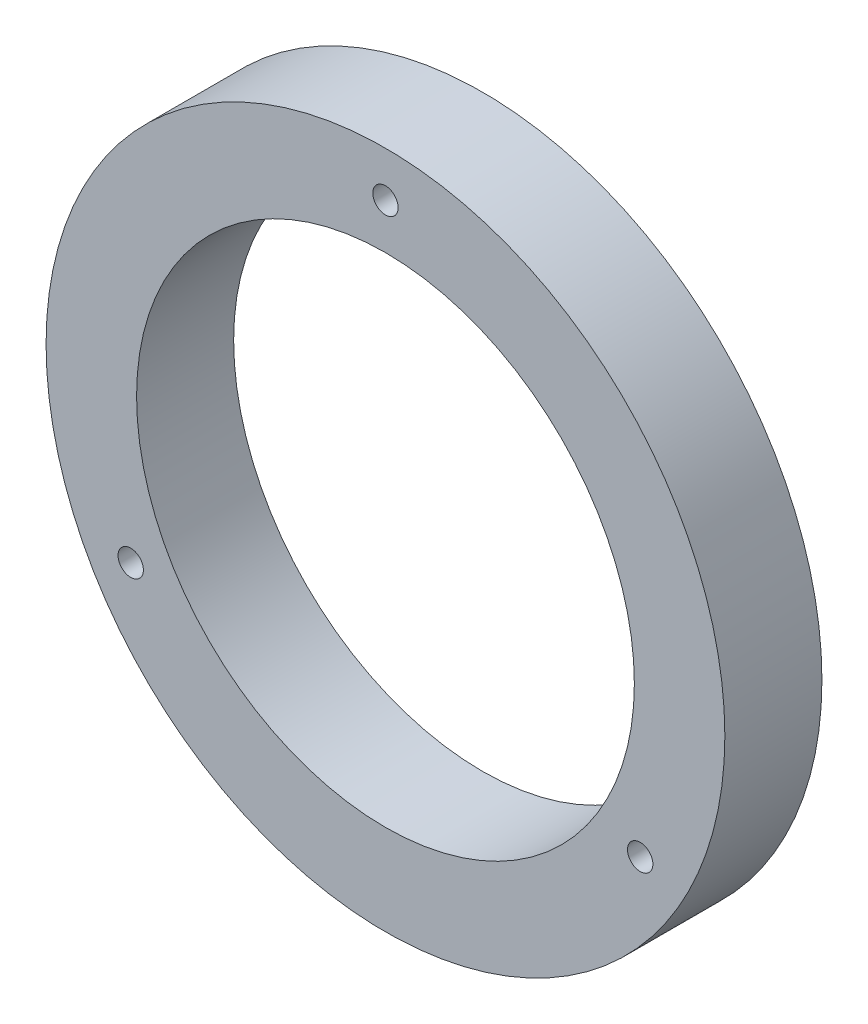
ISO-10303-21;
HEADER;
FILE_DESCRIPTION(('STEP AP214'),'2;1');
FILE_NAME('part.step','',(''),(''),'','','');
FILE_SCHEMA(('AUTOMOTIVE_DESIGN { 1 0 10303 214 1 1 1 1 }'));
ENDSEC;
DATA;
#1=APPLICATION_CONTEXT('core data for automotive mechanical design processes');
#2=APPLICATION_PROTOCOL_DEFINITION('international standard','automotive_design',2000,#1);
#3=PRODUCT_CONTEXT('',#1,'mechanical');
#4=PRODUCT('Part','Part','',(#3));
#5=PRODUCT_RELATED_PRODUCT_CATEGORY('part','',(#4));
#6=PRODUCT_DEFINITION_FORMATION('','',#4);
#7=PRODUCT_DEFINITION_CONTEXT('part definition',#1,'design');
#8=PRODUCT_DEFINITION('design','',#6,#7);
#9=PRODUCT_DEFINITION_SHAPE('','',#8);
#10=(LENGTH_UNIT() NAMED_UNIT(*) SI_UNIT(.MILLI.,.METRE.));
#11=(NAMED_UNIT(*) PLANE_ANGLE_UNIT() SI_UNIT($,.RADIAN.));
#12=(NAMED_UNIT(*) SI_UNIT($,.STERADIAN.) SOLID_ANGLE_UNIT());
#13=UNCERTAINTY_MEASURE_WITH_UNIT(LENGTH_MEASURE(1.E-05),#10,'distance_accuracy_value','');
#14=(GEOMETRIC_REPRESENTATION_CONTEXT(3) GLOBAL_UNCERTAINTY_ASSIGNED_CONTEXT((#13)) GLOBAL_UNIT_ASSIGNED_CONTEXT((#10,
#11,#12)) REPRESENTATION_CONTEXT('',''));
#15=CARTESIAN_POINT('',(0.,0.,0.));
#16=DIRECTION('',(0.,0.,1.));
#17=DIRECTION('',(1.,0.,0.));
#18=AXIS2_PLACEMENT_3D('',#15,#16,#17);
#19=CARTESIAN_POINT('',(0.,0.,21.45));
#20=DIRECTION('',(0.,0.,1.));
#21=DIRECTION('',(1.,0.,0.));
#22=AXIS2_PLACEMENT_3D('',#19,#20,#21);
#23=PLANE('',#22);
#24=CARTESIAN_POINT('',(0.,65.,21.45));
#25=DIRECTION('',(0.,0.,1.));
#26=DIRECTION('',(1.,0.,0.));
#27=AXIS2_PLACEMENT_3D('',#24,#25,#26);
#28=CIRCLE('',#27,2.8);
#29=CARTESIAN_POINT('',(2.8,65.,21.45));
#30=VERTEX_POINT('',#29);
#31=EDGE_CURVE('E67',#30,#30,#28,.T.);
#32=ORIENTED_EDGE('',*,*,#31,.F.);
#33=EDGE_LOOP('',(#32));
#34=FACE_BOUND('',#33,.T.);
#35=CARTESIAN_POINT('',(-56.2916512459884,-32.5000000000003,21.45));
#36=DIRECTION('',(0.,0.,1.));
#37=DIRECTION('',(1.,0.,0.));
#38=AXIS2_PLACEMENT_3D('',#35,#36,#37);
#39=CIRCLE('',#38,2.8);
#40=CARTESIAN_POINT('',(-53.4916512459884,-32.5000000000003,21.45));
#41=VERTEX_POINT('',#40);
#42=EDGE_CURVE('E74',#41,#41,#39,.T.);
#43=ORIENTED_EDGE('',*,*,#42,.F.);
#44=EDGE_LOOP('',(#43));
#45=FACE_BOUND('',#44,.T.);
#46=CARTESIAN_POINT('',(56.2916512459888,-32.4999999999995,21.45));
#47=DIRECTION('',(0.,0.,1.));
#48=DIRECTION('',(1.,0.,0.));
#49=AXIS2_PLACEMENT_3D('',#46,#47,#48);
#50=CIRCLE('',#49,2.8);
#51=CARTESIAN_POINT('',(59.0916512459888,-32.4999999999995,21.45));
#52=VERTEX_POINT('',#51);
#53=EDGE_CURVE('E78',#52,#52,#50,.T.);
#54=ORIENTED_EDGE('',*,*,#53,.F.);
#55=EDGE_LOOP('',(#54));
#56=FACE_BOUND('',#55,.T.);
#57=CARTESIAN_POINT('',(0.,0.,21.45));
#58=DIRECTION('',(0.,0.,1.));
#59=DIRECTION('',(1.,0.,0.));
#60=AXIS2_PLACEMENT_3D('',#57,#58,#59);
#61=CIRCLE('',#60,75.);
#62=CARTESIAN_POINT('',(75.,0.,21.45));
#63=VERTEX_POINT('',#62);
#64=EDGE_CURVE('E11',#63,#63,#61,.T.);
#65=ORIENTED_EDGE('',*,*,#64,.T.);
#66=EDGE_LOOP('',(#65));
#67=FACE_BOUND('',#66,.T.);
#68=CARTESIAN_POINT('',(0.,0.,21.45));
#69=DIRECTION('',(0.,0.,1.));
#70=DIRECTION('',(1.,0.,0.));
#71=AXIS2_PLACEMENT_3D('',#68,#69,#70);
#72=CIRCLE('',#71,55.);
#73=CARTESIAN_POINT('',(55.,0.,21.45));
#74=VERTEX_POINT('',#73);
#75=EDGE_CURVE('E61',#74,#74,#72,.T.);
#76=ORIENTED_EDGE('',*,*,#75,.F.);
#77=EDGE_LOOP('',(#76));
#78=FACE_BOUND('',#77,.T.);
#79=ADVANCED_FACE('F48',(#34,#45,#56,#67,#78),#23,.T.);
#80=CARTESIAN_POINT('',(0.,0.,0.));
#81=DIRECTION('',(0.,0.,1.));
#82=DIRECTION('',(1.,0.,0.));
#83=AXIS2_PLACEMENT_3D('',#80,#81,#82);
#84=PLANE('',#83);
#85=CARTESIAN_POINT('',(0.,65.,0.));
#86=DIRECTION('',(0.,0.,-1.));
#87=DIRECTION('',(-1.,0.,0.));
#88=AXIS2_PLACEMENT_3D('',#85,#86,#87);
#89=CIRCLE('',#88,2.8);
#90=CARTESIAN_POINT('',(-2.8,65.,0.));
#91=VERTEX_POINT('',#90);
#92=EDGE_CURVE('E82',#91,#91,#89,.T.);
#93=ORIENTED_EDGE('',*,*,#92,.F.);
#94=EDGE_LOOP('',(#93));
#95=FACE_BOUND('',#94,.T.);
#96=CARTESIAN_POINT('',(-56.2916512459884,-32.5000000000003,0.));
#97=DIRECTION('',(0.,0.,-1.));
#98=DIRECTION('',(-1.,0.,0.));
#99=AXIS2_PLACEMENT_3D('',#96,#97,#98);
#100=CIRCLE('',#99,2.8);
#101=CARTESIAN_POINT('',(-59.0916512459884,-32.5000000000003,0.));
#102=VERTEX_POINT('',#101);
#103=EDGE_CURVE('E87',#102,#102,#100,.T.);
#104=ORIENTED_EDGE('',*,*,#103,.F.);
#105=EDGE_LOOP('',(#104));
#106=FACE_BOUND('',#105,.T.);
#107=CARTESIAN_POINT('',(56.2916512459888,-32.4999999999995,0.));
#108=DIRECTION('',(0.,0.,-1.));
#109=DIRECTION('',(-1.,0.,0.));
#110=AXIS2_PLACEMENT_3D('',#107,#108,#109);
#111=CIRCLE('',#110,2.8);
#112=CARTESIAN_POINT('',(53.4916512459888,-32.4999999999995,0.));
#113=VERTEX_POINT('',#112);
#114=EDGE_CURVE('E83',#113,#113,#111,.T.);
#115=ORIENTED_EDGE('',*,*,#114,.F.);
#116=EDGE_LOOP('',(#115));
#117=FACE_BOUND('',#116,.T.);
#118=CARTESIAN_POINT('',(0.,0.,0.));
#119=DIRECTION('',(0.,0.,1.));
#120=DIRECTION('',(1.,0.,0.));
#121=AXIS2_PLACEMENT_3D('',#118,#119,#120);
#122=CIRCLE('',#121,75.);
#123=CARTESIAN_POINT('',(75.,0.,0.));
#124=VERTEX_POINT('',#123);
#125=EDGE_CURVE('E52',#124,#124,#122,.T.);
#126=ORIENTED_EDGE('',*,*,#125,.F.);
#127=EDGE_LOOP('',(#126));
#128=FACE_BOUND('',#127,.T.);
#129=CARTESIAN_POINT('',(0.,0.,0.));
#130=DIRECTION('',(0.,0.,1.));
#131=DIRECTION('',(1.,0.,0.));
#132=AXIS2_PLACEMENT_3D('',#129,#130,#131);
#133=CIRCLE('',#132,55.);
#134=CARTESIAN_POINT('',(55.,0.,0.));
#135=VERTEX_POINT('',#134);
#136=EDGE_CURVE('E63',#135,#135,#133,.T.);
#137=ORIENTED_EDGE('',*,*,#136,.T.);
#138=EDGE_LOOP('',(#137));
#139=FACE_BOUND('',#138,.T.);
#140=ADVANCED_FACE('F97',(#95,#106,#117,#128,#139),#84,.F.);
#141=CARTESIAN_POINT('',(0.,0.,21.45));
#142=DIRECTION('',(0.,0.,-1.));
#143=DIRECTION('',(-1.,0.,0.));
#144=AXIS2_PLACEMENT_3D('',#141,#142,#143);
#145=CYLINDRICAL_SURFACE('',#144,75.);
#146=ORIENTED_EDGE('',*,*,#64,.F.);
#147=EDGE_LOOP('',(#146));
#148=FACE_BOUND('',#147,.T.);
#149=ORIENTED_EDGE('',*,*,#125,.T.);
#150=EDGE_LOOP('',(#149));
#151=FACE_BOUND('',#150,.T.);
#152=ADVANCED_FACE('F50',(#148,#151),#145,.T.);
#153=CARTESIAN_POINT('',(0.,0.,21.45));
#154=DIRECTION('',(0.,0.,-1.));
#155=DIRECTION('',(-1.,0.,0.));
#156=AXIS2_PLACEMENT_3D('',#153,#154,#155);
#157=CYLINDRICAL_SURFACE('',#156,55.);
#158=ORIENTED_EDGE('',*,*,#75,.T.);
#159=EDGE_LOOP('',(#158));
#160=FACE_BOUND('',#159,.T.);
#161=ORIENTED_EDGE('',*,*,#136,.F.);
#162=EDGE_LOOP('',(#161));
#163=FACE_BOUND('',#162,.T.);
#164=ADVANCED_FACE('F108',(#160,#163),#157,.F.);
#165=CARTESIAN_POINT('',(56.2916512459888,-32.4999999999995,27.8));
#166=DIRECTION('',(0.,0.,-1.));
#167=DIRECTION('',(-1.,0.,0.));
#168=AXIS2_PLACEMENT_3D('',#165,#166,#167);
#169=CYLINDRICAL_SURFACE('',#168,2.8);
#170=ORIENTED_EDGE('',*,*,#53,.T.);
#171=EDGE_LOOP('',(#170));
#172=FACE_BOUND('',#171,.T.);
#173=ORIENTED_EDGE('',*,*,#114,.T.);
#174=EDGE_LOOP('',(#173));
#175=FACE_BOUND('',#174,.T.);
#176=ADVANCED_FACE('F110',(#172,#175),#169,.F.);
#177=CARTESIAN_POINT('',(-56.2916512459884,-32.5000000000003,27.8));
#178=DIRECTION('',(0.,0.,-1.));
#179=DIRECTION('',(-1.,0.,0.));
#180=AXIS2_PLACEMENT_3D('',#177,#178,#179);
#181=CYLINDRICAL_SURFACE('',#180,2.8);
#182=ORIENTED_EDGE('',*,*,#42,.T.);
#183=EDGE_LOOP('',(#182));
#184=FACE_BOUND('',#183,.T.);
#185=ORIENTED_EDGE('',*,*,#103,.T.);
#186=EDGE_LOOP('',(#185));
#187=FACE_BOUND('',#186,.T.);
#188=ADVANCED_FACE('F117',(#184,#187),#181,.F.);
#189=CARTESIAN_POINT('',(0.,65.,27.8));
#190=DIRECTION('',(0.,0.,-1.));
#191=DIRECTION('',(-1.,0.,0.));
#192=AXIS2_PLACEMENT_3D('',#189,#190,#191);
#193=CYLINDRICAL_SURFACE('',#192,2.8);
#194=ORIENTED_EDGE('',*,*,#31,.T.);
#195=EDGE_LOOP('',(#194));
#196=FACE_BOUND('',#195,.T.);
#197=ORIENTED_EDGE('',*,*,#92,.T.);
#198=EDGE_LOOP('',(#197));
#199=FACE_BOUND('',#198,.T.);
#200=ADVANCED_FACE('F95',(#196,#199),#193,.F.);
#201=CLOSED_SHELL('',(#79,#140,#152,#164,#176,#188,#200));
#202=MANIFOLD_SOLID_BREP('B2',#201);
#203=ADVANCED_BREP_SHAPE_REPRESENTATION('',(#18,#202),#14);
#204=SHAPE_DEFINITION_REPRESENTATION(#9,#203);
ENDSEC;
END-ISO-10303-21;
